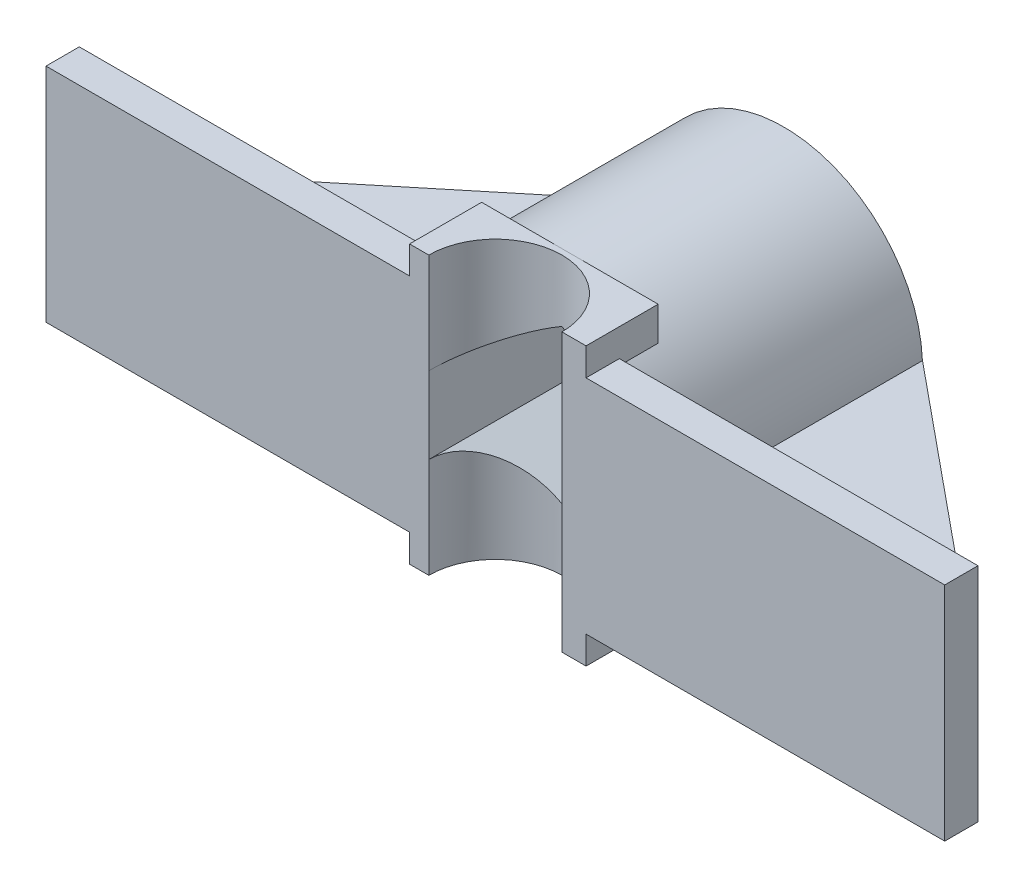
ISO-10303-21;
HEADER;
FILE_DESCRIPTION(('STEP AP214'),'2;1');
FILE_NAME('part.step','',(''),(''),'','','');
FILE_SCHEMA(('AUTOMOTIVE_DESIGN { 1 0 10303 214 1 1 1 1 }'));
ENDSEC;
DATA;
#1=APPLICATION_CONTEXT('core data for automotive mechanical design processes');
#2=APPLICATION_PROTOCOL_DEFINITION('international standard','automotive_design',2000,#1);
#3=PRODUCT_CONTEXT('',#1,'mechanical');
#4=PRODUCT('Part','Part','',(#3));
#5=PRODUCT_RELATED_PRODUCT_CATEGORY('part','',(#4));
#6=PRODUCT_DEFINITION_FORMATION('','',#4);
#7=PRODUCT_DEFINITION_CONTEXT('part definition',#1,'design');
#8=PRODUCT_DEFINITION('design','',#6,#7);
#9=PRODUCT_DEFINITION_SHAPE('','',#8);
#10=(LENGTH_UNIT() NAMED_UNIT(*) SI_UNIT(.MILLI.,.METRE.));
#11=(NAMED_UNIT(*) PLANE_ANGLE_UNIT() SI_UNIT($,.RADIAN.));
#12=(NAMED_UNIT(*) SI_UNIT($,.STERADIAN.) SOLID_ANGLE_UNIT());
#13=UNCERTAINTY_MEASURE_WITH_UNIT(LENGTH_MEASURE(1.E-05),#10,'distance_accuracy_value','');
#14=(GEOMETRIC_REPRESENTATION_CONTEXT(3) GLOBAL_UNCERTAINTY_ASSIGNED_CONTEXT((#13)) GLOBAL_UNIT_ASSIGNED_CONTEXT((#10,
#11,#12)) REPRESENTATION_CONTEXT('',''));
#15=CARTESIAN_POINT('',(0.,0.,0.));
#16=DIRECTION('',(0.,0.,1.));
#17=DIRECTION('',(1.,0.,0.));
#18=AXIS2_PLACEMENT_3D('',#15,#16,#17);
#19=CARTESIAN_POINT('',(0.,0.,-6.));
#20=DIRECTION('',(0.,0.,-1.));
#21=DIRECTION('',(-1.,0.,0.));
#22=AXIS2_PLACEMENT_3D('',#19,#20,#21);
#23=PLANE('',#22);
#24=DIRECTION('',(0.,-1.,0.));
#25=VECTOR('',#24,1.);
#26=CARTESIAN_POINT('',(-81.,-20.,-6.));
#27=LINE('',#26,#25);
#28=CARTESIAN_POINT('',(-81.,-1.,-5.99999999999996));
#29=VERTEX_POINT('',#28);
#30=CARTESIAN_POINT('',(-81.,-20.,-6.));
#31=VERTEX_POINT('',#30);
#32=EDGE_CURVE('E474',#29,#31,#27,.T.);
#33=ORIENTED_EDGE('',*,*,#32,.F.);
#34=DIRECTION('',(1.,0.,0.));
#35=VECTOR('',#34,1.);
#36=CARTESIAN_POINT('',(0.,-1.,-6.));
#37=LINE('',#36,#35);
#38=CARTESIAN_POINT('',(-24.9799919935936,-1.,-6.));
#39=VERTEX_POINT('',#38);
#40=EDGE_CURVE('E263',#29,#39,#37,.T.);
#41=ORIENTED_EDGE('',*,*,#40,.T.);
#42=CARTESIAN_POINT('',(0.,0.,-6.));
#43=DIRECTION('',(0.,0.,-1.));
#44=DIRECTION('',(-1.,0.,0.));
#45=AXIS2_PLACEMENT_3D('',#42,#43,#44);
#46=CIRCLE('',#45,25.);
#47=CARTESIAN_POINT('',(-15.4708746013094,-19.6380253353172,-6.));
#48=VERTEX_POINT('',#47);
#49=EDGE_CURVE('E364',#48,#39,#46,.T.);
#50=ORIENTED_EDGE('',*,*,#49,.F.);
#51=DIRECTION('',(0.,1.,0.));
#52=VECTOR('',#51,1.);
#53=CARTESIAN_POINT('',(-15.4708746013094,0.,-6.));
#54=LINE('',#53,#52);
#55=CARTESIAN_POINT('',(-15.4708746013094,-20.,-6.));
#56=VERTEX_POINT('',#55);
#57=EDGE_CURVE('E459',#56,#48,#54,.T.);
#58=ORIENTED_EDGE('',*,*,#57,.F.);
#59=DIRECTION('',(1.,0.,0.));
#60=VECTOR('',#59,1.);
#61=CARTESIAN_POINT('',(-81.,-20.,-6.));
#62=LINE('',#61,#60);
#63=EDGE_CURVE('E479',#31,#56,#62,.T.);
#64=ORIENTED_EDGE('',*,*,#63,.F.);
#65=EDGE_LOOP('',(#33,#41,#50,#58,#64));
#66=FACE_BOUND('',#65,.T.);
#67=ADVANCED_FACE('F39',(#66),#23,.T.);
#68=CARTESIAN_POINT('',(0.,0.,-6.));
#69=DIRECTION('',(0.,0.,-1.));
#70=DIRECTION('',(-1.,0.,0.));
#71=AXIS2_PLACEMENT_3D('',#68,#69,#70);
#72=CYLINDRICAL_SURFACE('',#71,25.);
#73=ORIENTED_EDGE('',*,*,#49,.T.);
#74=DIRECTION('',(0.,0.,-1.));
#75=VECTOR('',#74,1.);
#76=CARTESIAN_POINT('',(-24.9799919935936,-1.,-6.));
#77=LINE('',#76,#75);
#78=CARTESIAN_POINT('',(-24.9799919935936,-1.,-52.));
#79=VERTEX_POINT('',#78);
#80=EDGE_CURVE('E284',#39,#79,#77,.T.);
#81=ORIENTED_EDGE('',*,*,#80,.T.);
#82=CARTESIAN_POINT('',(0.,0.,-52.));
#83=DIRECTION('',(0.,0.,-1.));
#84=DIRECTION('',(-1.,0.,0.));
#85=AXIS2_PLACEMENT_3D('',#82,#83,#84);
#86=CIRCLE('',#85,25.);
#87=CARTESIAN_POINT('',(24.9799919935936,-1.,-52.));
#88=VERTEX_POINT('',#87);
#89=EDGE_CURVE('E64',#88,#79,#86,.T.);
#90=ORIENTED_EDGE('',*,*,#89,.F.);
#91=DIRECTION('',(0.,0.,-1.));
#92=VECTOR('',#91,1.);
#93=CARTESIAN_POINT('',(24.9799919935936,-1.,-6.));
#94=LINE('',#93,#92);
#95=CARTESIAN_POINT('',(24.9799919935936,-1.,-6.));
#96=VERTEX_POINT('',#95);
#97=EDGE_CURVE('E306',#88,#96,#94,.F.);
#98=ORIENTED_EDGE('',*,*,#97,.T.);
#99=CARTESIAN_POINT('',(16.3499015672928,-18.9124487769256,-6.));
#100=VERTEX_POINT('',#99);
#101=EDGE_CURVE('E367',#96,#100,#46,.T.);
#102=ORIENTED_EDGE('',*,*,#101,.T.);
#103=DIRECTION('',(0.,0.,-1.));
#104=VECTOR('',#103,1.);
#105=CARTESIAN_POINT('',(16.3499015672928,-18.9124487769256,-6.));
#106=LINE('',#105,#104);
#107=CARTESIAN_POINT('',(16.3499015672928,-18.9124487769256,-13.));
#108=VERTEX_POINT('',#107);
#109=EDGE_CURVE('E380',#100,#108,#106,.T.);
#110=ORIENTED_EDGE('',*,*,#109,.T.);
#111=CARTESIAN_POINT('',(0.,0.,-13.));
#112=DIRECTION('',(0.,0.,-1.));
#113=DIRECTION('',(-1.,0.,0.));
#114=AXIS2_PLACEMENT_3D('',#111,#112,#113);
#115=CIRCLE('',#114,25.);
#116=CARTESIAN_POINT('',(0.,-25.,-13.));
#117=VERTEX_POINT('',#116);
#118=EDGE_CURVE('E383',#108,#117,#115,.T.);
#119=ORIENTED_EDGE('',*,*,#118,.T.);
#120=CARTESIAN_POINT('',(-15.4708746013094,-19.6380253353172,-13.));
#121=VERTEX_POINT('',#120);
#122=EDGE_CURVE('E369',#117,#121,#115,.T.);
#123=ORIENTED_EDGE('',*,*,#122,.T.);
#124=DIRECTION('',(0.,0.,-1.));
#125=VECTOR('',#124,1.);
#126=CARTESIAN_POINT('',(-15.4708746013094,-19.6380253353172,-6.));
#127=LINE('',#126,#125);
#128=EDGE_CURVE('E372',#121,#48,#127,.F.);
#129=ORIENTED_EDGE('',*,*,#128,.T.);
#130=EDGE_LOOP('',(#73,#81,#90,#98,#102,#110,#119,#123,#129));
#131=FACE_BOUND('',#130,.T.);
#132=ADVANCED_FACE('F594',(#131),#72,.T.);
#133=ORIENTED_EDGE('',*,*,#101,.F.);
#134=DIRECTION('',(1.,0.,0.));
#135=VECTOR('',#134,1.);
#136=CARTESIAN_POINT('',(0.,-1.,-6.));
#137=LINE('',#136,#135);
#138=CARTESIAN_POINT('',(81.,-1.,-6.00000000000001));
#139=VERTEX_POINT('',#138);
#140=EDGE_CURVE('E303',#96,#139,#137,.T.);
#141=ORIENTED_EDGE('',*,*,#140,.T.);
#142=DIRECTION('',(0.,1.,0.));
#143=VECTOR('',#142,1.);
#144=CARTESIAN_POINT('',(81.,-20.,-6.));
#145=LINE('',#144,#143);
#146=CARTESIAN_POINT('',(81.,-20.,-6.));
#147=VERTEX_POINT('',#146);
#148=EDGE_CURVE('E466',#147,#139,#145,.T.);
#149=ORIENTED_EDGE('',*,*,#148,.F.);
#150=CARTESIAN_POINT('',(16.3499015672928,-20.,-6.));
#151=VERTEX_POINT('',#150);
#152=EDGE_CURVE('E478',#151,#147,#62,.T.);
#153=ORIENTED_EDGE('',*,*,#152,.F.);
#154=DIRECTION('',(0.,-1.,0.));
#155=VECTOR('',#154,1.);
#156=CARTESIAN_POINT('',(16.3499015672928,0.,-6.));
#157=LINE('',#156,#155);
#158=EDGE_CURVE('E443',#100,#151,#157,.T.);
#159=ORIENTED_EDGE('',*,*,#158,.F.);
#160=EDGE_LOOP('',(#133,#141,#149,#153,#159));
#161=FACE_BOUND('',#160,.T.);
#162=ADVANCED_FACE('F588',(#161),#23,.T.);
#163=CARTESIAN_POINT('',(0.,-25.,0.));
#164=DIRECTION('',(0.,1.,0.));
#165=DIRECTION('',(0.,0.,1.));
#166=AXIS2_PLACEMENT_3D('',#163,#164,#165);
#167=CYLINDRICAL_SURFACE('',#166,12.);
#168=CARTESIAN_POINT('',(0.,-13.856406460551,0.));
#169=DIRECTION('',(0.5,-0.866025403784439,0.));
#170=DIRECTION('',(0.866025403784439,0.5,0.));
#171=AXIS2_PLACEMENT_3D('',#168,#169,#170);
#172=ELLIPSE('',#171,13.856406460551,12.);
#173=CARTESIAN_POINT('',(12.,-6.92820323027551,0.));
#174=VERTEX_POINT('',#173);
#175=CARTESIAN_POINT('',(0.,-13.856406460551,-12.));
#176=VERTEX_POINT('',#175);
#177=EDGE_CURVE('E352',#174,#176,#172,.F.);
#178=ORIENTED_EDGE('',*,*,#177,.T.);
#179=CARTESIAN_POINT('',(0.,-13.856406460551,0.));
#180=DIRECTION('',(-0.5,-0.866025403784439,0.));
#181=DIRECTION('',(-0.866025403784439,0.5,0.));
#182=AXIS2_PLACEMENT_3D('',#179,#180,#181);
#183=ELLIPSE('',#182,13.856406460551,12.);
#184=CARTESIAN_POINT('',(-12.,-6.92820323027551,0.));
#185=VERTEX_POINT('',#184);
#186=EDGE_CURVE('E355',#176,#185,#183,.F.);
#187=ORIENTED_EDGE('',*,*,#186,.T.);
#188=DIRECTION('',(0.,1.,0.));
#189=VECTOR('',#188,1.);
#190=CARTESIAN_POINT('',(-12.,-25.,0.));
#191=LINE('',#190,#189);
#192=CARTESIAN_POINT('',(-12.,-25.,0.));
#193=VERTEX_POINT('',#192);
#194=EDGE_CURVE('E398',#193,#185,#191,.T.);
#195=ORIENTED_EDGE('',*,*,#194,.F.);
#196=CARTESIAN_POINT('',(0.,-25.,0.));
#197=DIRECTION('',(0.,1.,0.));
#198=DIRECTION('',(0.,0.,1.));
#199=AXIS2_PLACEMENT_3D('',#196,#197,#198);
#200=CIRCLE('',#199,12.);
#201=CARTESIAN_POINT('',(12.,-25.,0.));
#202=VERTEX_POINT('',#201);
#203=EDGE_CURVE('E388',#202,#193,#200,.T.);
#204=ORIENTED_EDGE('',*,*,#203,.F.);
#205=DIRECTION('',(0.,1.,0.));
#206=VECTOR('',#205,1.);
#207=CARTESIAN_POINT('',(12.,-25.,0.));
#208=LINE('',#207,#206);
#209=EDGE_CURVE('E393',#202,#174,#208,.T.);
#210=ORIENTED_EDGE('',*,*,#209,.T.);
#211=EDGE_LOOP('',(#178,#187,#195,#204,#210));
#212=FACE_BOUND('',#211,.T.);
#213=ADVANCED_FACE('F568',(#212),#167,.F.);
#214=CARTESIAN_POINT('',(-15.4708746013094,0.,0.));
#215=DIRECTION('',(-1.,0.,0.));
#216=DIRECTION('',(0.,0.,1.));
#217=AXIS2_PLACEMENT_3D('',#214,#215,#216);
#218=PLANE('',#217);
#219=DIRECTION('',(0.,0.,-1.));
#220=VECTOR('',#219,1.);
#221=CARTESIAN_POINT('',(-15.4708746013094,19.6380253353172,-6.));
#222=LINE('',#221,#220);
#223=CARTESIAN_POINT('',(-15.4708746013094,19.6380253353172,-6.));
#224=VERTEX_POINT('',#223);
#225=CARTESIAN_POINT('',(-15.4708746013094,19.6380253353172,-13.));
#226=VERTEX_POINT('',#225);
#227=EDGE_CURVE('E384',#224,#226,#222,.T.);
#228=ORIENTED_EDGE('',*,*,#227,.F.);
#229=CARTESIAN_POINT('',(-15.4708746013094,20.,-6.));
#230=VERTEX_POINT('',#229);
#231=EDGE_CURVE('E458',#224,#230,#54,.T.);
#232=ORIENTED_EDGE('',*,*,#231,.T.);
#233=DIRECTION('',(0.,0.,1.));
#234=VECTOR('',#233,1.);
#235=CARTESIAN_POINT('',(-15.4708746013094,20.,-6.));
#236=LINE('',#235,#234);
#237=CARTESIAN_POINT('',(-15.4708746013094,20.,0.));
#238=VERTEX_POINT('',#237);
#239=EDGE_CURVE('E462',#230,#238,#236,.T.);
#240=ORIENTED_EDGE('',*,*,#239,.T.);
#241=DIRECTION('',(0.,1.,0.));
#242=VECTOR('',#241,1.);
#243=CARTESIAN_POINT('',(-15.4708746013094,0.,0.));
#244=LINE('',#243,#242);
#245=CARTESIAN_POINT('',(-15.4708746013094,25.,0.));
#246=VERTEX_POINT('',#245);
#247=EDGE_CURVE('E439',#238,#246,#244,.T.);
#248=ORIENTED_EDGE('',*,*,#247,.T.);
#249=DIRECTION('',(0.,0.,1.));
#250=VECTOR('',#249,1.);
#251=CARTESIAN_POINT('',(-15.4708746013094,25.,0.));
#252=LINE('',#251,#250);
#253=CARTESIAN_POINT('',(-15.4708746013094,25.,-13.));
#254=VERTEX_POINT('',#253);
#255=EDGE_CURVE('E425',#254,#246,#252,.T.);
#256=ORIENTED_EDGE('',*,*,#255,.F.);
#257=DIRECTION('',(0.,1.,0.));
#258=VECTOR('',#257,1.);
#259=CARTESIAN_POINT('',(-15.4708746013094,0.,-13.));
#260=LINE('',#259,#258);
#261=EDGE_CURVE('E444',#226,#254,#260,.T.);
#262=ORIENTED_EDGE('',*,*,#261,.F.);
#263=EDGE_LOOP('',(#228,#232,#240,#248,#256,#262));
#264=FACE_BOUND('',#263,.T.);
#265=ADVANCED_FACE('F534',(#264),#218,.T.);
#266=CARTESIAN_POINT('',(-15.4708746013094,0.,-13.));
#267=DIRECTION('',(0.,0.,-1.));
#268=DIRECTION('',(-1.,0.,0.));
#269=AXIS2_PLACEMENT_3D('',#266,#267,#268);
#270=PLANE('',#269);
#271=CARTESIAN_POINT('',(0.,25.,-13.));
#272=VERTEX_POINT('',#271);
#273=EDGE_CURVE('E373',#226,#272,#115,.T.);
#274=ORIENTED_EDGE('',*,*,#273,.F.);
#275=ORIENTED_EDGE('',*,*,#261,.T.);
#276=DIRECTION('',(-1.,0.,0.));
#277=VECTOR('',#276,1.);
#278=CARTESIAN_POINT('',(-15.4708746013094,25.,-13.));
#279=LINE('',#278,#277);
#280=EDGE_CURVE('E435',#272,#254,#279,.T.);
#281=ORIENTED_EDGE('',*,*,#280,.F.);
#282=EDGE_LOOP('',(#274,#275,#281));
#283=FACE_BOUND('',#282,.T.);
#284=ADVANCED_FACE('F529',(#283),#270,.T.);
#285=CARTESIAN_POINT('',(16.3499015672928,18.9124487769256,-13.));
#286=VERTEX_POINT('',#285);
#287=EDGE_CURVE('E374',#272,#286,#115,.T.);
#288=ORIENTED_EDGE('',*,*,#287,.F.);
#289=CARTESIAN_POINT('',(16.3499015672928,25.,-13.));
#290=VERTEX_POINT('',#289);
#291=EDGE_CURVE('E436',#290,#272,#279,.T.);
#292=ORIENTED_EDGE('',*,*,#291,.F.);
#293=DIRECTION('',(0.,1.,0.));
#294=VECTOR('',#293,1.);
#295=CARTESIAN_POINT('',(16.3499015672928,0.,-13.));
#296=LINE('',#295,#294);
#297=EDGE_CURVE('E448',#286,#290,#296,.T.);
#298=ORIENTED_EDGE('',*,*,#297,.F.);
#299=EDGE_LOOP('',(#288,#292,#298));
#300=FACE_BOUND('',#299,.T.);
#301=ADVANCED_FACE('F524',(#300),#270,.T.);
#302=ORIENTED_EDGE('',*,*,#118,.F.);
#303=CARTESIAN_POINT('',(16.3499015672928,-25.,-13.));
#304=VERTEX_POINT('',#303);
#305=EDGE_CURVE('E445',#304,#108,#296,.T.);
#306=ORIENTED_EDGE('',*,*,#305,.F.);
#307=DIRECTION('',(-1.,0.,0.));
#308=VECTOR('',#307,1.);
#309=CARTESIAN_POINT('',(-15.4708746013094,-25.,-13.));
#310=LINE('',#309,#308);
#311=EDGE_CURVE('E404',#304,#117,#310,.T.);
#312=ORIENTED_EDGE('',*,*,#311,.T.);
#313=EDGE_LOOP('',(#302,#306,#312));
#314=FACE_BOUND('',#313,.T.);
#315=ADVANCED_FACE('F795',(#314),#270,.T.);
#316=CARTESIAN_POINT('',(16.3499015672928,0.,0.));
#317=DIRECTION('',(1.,0.,0.));
#318=DIRECTION('',(0.,0.,-1.));
#319=AXIS2_PLACEMENT_3D('',#316,#317,#318);
#320=PLANE('',#319);
#321=ORIENTED_EDGE('',*,*,#109,.F.);
#322=ORIENTED_EDGE('',*,*,#158,.T.);
#323=DIRECTION('',(0.,0.,-1.));
#324=VECTOR('',#323,1.);
#325=CARTESIAN_POINT('',(16.3499015672928,-20.,-6.));
#326=LINE('',#325,#324);
#327=CARTESIAN_POINT('',(16.3499015672928,-20.,0.));
#328=VERTEX_POINT('',#327);
#329=EDGE_CURVE('E417',#328,#151,#326,.T.);
#330=ORIENTED_EDGE('',*,*,#329,.F.);
#331=DIRECTION('',(0.,-1.,0.));
#332=VECTOR('',#331,1.);
#333=CARTESIAN_POINT('',(16.3499015672928,0.,0.));
#334=LINE('',#333,#332);
#335=CARTESIAN_POINT('',(16.3499015672928,-25.,0.));
#336=VERTEX_POINT('',#335);
#337=EDGE_CURVE('E414',#328,#336,#334,.T.);
#338=ORIENTED_EDGE('',*,*,#337,.T.);
#339=DIRECTION('',(0.,0.,-1.));
#340=VECTOR('',#339,1.);
#341=CARTESIAN_POINT('',(16.3499015672928,-25.,0.));
#342=LINE('',#341,#340);
#343=EDGE_CURVE('E407',#336,#304,#342,.T.);
#344=ORIENTED_EDGE('',*,*,#343,.T.);
#345=ORIENTED_EDGE('',*,*,#305,.T.);
#346=EDGE_LOOP('',(#321,#322,#330,#338,#344,#345));
#347=FACE_BOUND('',#346,.T.);
#348=ADVANCED_FACE('F580',(#347),#320,.T.);
#349=CARTESIAN_POINT('',(0.,0.,0.));
#350=DIRECTION('',(0.,0.,-1.));
#351=DIRECTION('',(-1.,0.,0.));
#352=AXIS2_PLACEMENT_3D('',#349,#350,#351);
#353=PLANE('',#352);
#354=DIRECTION('',(0.,-1.,0.));
#355=VECTOR('',#354,1.);
#356=CARTESIAN_POINT('',(-81.,-20.,0.));
#357=LINE('',#356,#355);
#358=CARTESIAN_POINT('',(-81.,20.,0.));
#359=VERTEX_POINT('',#358);
#360=CARTESIAN_POINT('',(-81.,-20.,0.));
#361=VERTEX_POINT('',#360);
#362=EDGE_CURVE('E487',#359,#361,#357,.T.);
#363=ORIENTED_EDGE('',*,*,#362,.T.);
#364=DIRECTION('',(1.,0.,0.));
#365=VECTOR('',#364,1.);
#366=CARTESIAN_POINT('',(-81.,-20.,0.));
#367=LINE('',#366,#365);
#368=CARTESIAN_POINT('',(-15.4708746013094,-20.,0.));
#369=VERTEX_POINT('',#368);
#370=EDGE_CURVE('E490',#361,#369,#367,.T.);
#371=ORIENTED_EDGE('',*,*,#370,.T.);
#372=DIRECTION('',(0.,-1.,0.));
#373=VECTOR('',#372,1.);
#374=CARTESIAN_POINT('',(-15.4708746013094,0.,0.));
#375=LINE('',#374,#373);
#376=CARTESIAN_POINT('',(-15.4708746013094,-25.,0.));
#377=VERTEX_POINT('',#376);
#378=EDGE_CURVE('E415',#369,#377,#375,.T.);
#379=ORIENTED_EDGE('',*,*,#378,.T.);
#380=DIRECTION('',(1.,0.,0.));
#381=VECTOR('',#380,1.);
#382=CARTESIAN_POINT('',(-15.4708746013094,-25.,0.));
#383=LINE('',#382,#381);
#384=EDGE_CURVE('E411',#377,#193,#383,.T.);
#385=ORIENTED_EDGE('',*,*,#384,.T.);
#386=ORIENTED_EDGE('',*,*,#194,.T.);
#387=DIRECTION('',(0.,1.,0.));
#388=VECTOR('',#387,1.);
#389=CARTESIAN_POINT('',(-12.,-6.92820323027551,0.));
#390=LINE('',#389,#388);
#391=CARTESIAN_POINT('',(-12.,6.92820323027552,0.));
#392=VERTEX_POINT('',#391);
#393=EDGE_CURVE('E318',#185,#392,#390,.T.);
#394=ORIENTED_EDGE('',*,*,#393,.T.);
#395=CARTESIAN_POINT('',(-12.,25.,0.));
#396=VERTEX_POINT('',#395);
#397=EDGE_CURVE('E390',#392,#396,#191,.T.);
#398=ORIENTED_EDGE('',*,*,#397,.T.);
#399=DIRECTION('',(1.,0.,0.));
#400=VECTOR('',#399,1.);
#401=CARTESIAN_POINT('',(-15.4708746013094,25.,0.));
#402=LINE('',#401,#400);
#403=EDGE_CURVE('E429',#246,#396,#402,.T.);
#404=ORIENTED_EDGE('',*,*,#403,.F.);
#405=ORIENTED_EDGE('',*,*,#247,.F.);
#406=DIRECTION('',(-1.,0.,0.));
#407=VECTOR('',#406,1.);
#408=CARTESIAN_POINT('',(-81.,20.,0.));
#409=LINE('',#408,#407);
#410=EDGE_CURVE('E483',#238,#359,#409,.T.);
#411=ORIENTED_EDGE('',*,*,#410,.T.);
#412=EDGE_LOOP('',(#363,#371,#379,#385,#386,#394,#398,#404,#405,#411));
#413=FACE_BOUND('',#412,.T.);
#414=ADVANCED_FACE('F539',(#413),#353,.F.);
#415=CARTESIAN_POINT('',(-81.,-20.,-6.));
#416=DIRECTION('',(0.,-1.,0.));
#417=DIRECTION('',(0.,0.,-1.));
#418=AXIS2_PLACEMENT_3D('',#415,#416,#417);
#419=PLANE('',#418);
#420=ORIENTED_EDGE('',*,*,#63,.T.);
#421=DIRECTION('',(0.,0.,1.));
#422=VECTOR('',#421,1.);
#423=CARTESIAN_POINT('',(-15.4708746013094,-20.,-6.));
#424=LINE('',#423,#422);
#425=EDGE_CURVE('E422',#56,#369,#424,.T.);
#426=ORIENTED_EDGE('',*,*,#425,.T.);
#427=ORIENTED_EDGE('',*,*,#370,.F.);
#428=DIRECTION('',(0.,0.,1.));
#429=VECTOR('',#428,1.);
#430=CARTESIAN_POINT('',(-81.,-20.,-6.));
#431=LINE('',#430,#429);
#432=EDGE_CURVE('E48',#31,#361,#431,.T.);
#433=ORIENTED_EDGE('',*,*,#432,.F.);
#434=EDGE_LOOP('',(#420,#426,#427,#433));
#435=FACE_BOUND('',#434,.T.);
#436=ADVANCED_FACE('F610',(#435),#419,.T.);
#437=CARTESIAN_POINT('',(81.,-20.,0.));
#438=VERTEX_POINT('',#437);
#439=EDGE_CURVE('E489',#328,#438,#367,.T.);
#440=ORIENTED_EDGE('',*,*,#439,.F.);
#441=ORIENTED_EDGE('',*,*,#329,.T.);
#442=ORIENTED_EDGE('',*,*,#152,.T.);
#443=DIRECTION('',(0.,0.,1.));
#444=VECTOR('',#443,1.);
#445=CARTESIAN_POINT('',(81.,-20.,-6.));
#446=LINE('',#445,#444);
#447=EDGE_CURVE('E11',#147,#438,#446,.T.);
#448=ORIENTED_EDGE('',*,*,#447,.T.);
#449=EDGE_LOOP('',(#440,#441,#442,#448));
#450=FACE_BOUND('',#449,.T.);
#451=ADVANCED_FACE('F583',(#450),#419,.T.);
#452=DIRECTION('',(1.,0.,0.));
#453=VECTOR('',#452,1.);
#454=CARTESIAN_POINT('',(0.,1.,-6.));
#455=LINE('',#454,#453);
#456=CARTESIAN_POINT('',(-81.,1.,-5.99999999999996));
#457=VERTEX_POINT('',#456);
#458=CARTESIAN_POINT('',(-24.9799919935936,1.,-6.));
#459=VERTEX_POINT('',#458);
#460=EDGE_CURVE('E286',#457,#459,#455,.T.);
#461=ORIENTED_EDGE('',*,*,#460,.F.);
#462=CARTESIAN_POINT('',(-81.,20.,-6.));
#463=VERTEX_POINT('',#462);
#464=EDGE_CURVE('E475',#463,#457,#27,.T.);
#465=ORIENTED_EDGE('',*,*,#464,.F.);
#466=DIRECTION('',(-1.,0.,0.));
#467=VECTOR('',#466,1.);
#468=CARTESIAN_POINT('',(-81.,20.,-6.));
#469=LINE('',#468,#467);
#470=EDGE_CURVE('E469',#230,#463,#469,.T.);
#471=ORIENTED_EDGE('',*,*,#470,.F.);
#472=ORIENTED_EDGE('',*,*,#231,.F.);
#473=EDGE_CURVE('E363',#459,#224,#46,.T.);
#474=ORIENTED_EDGE('',*,*,#473,.F.);
#475=EDGE_LOOP('',(#461,#465,#471,#472,#474));
#476=FACE_BOUND('',#475,.T.);
#477=ADVANCED_FACE('F602',(#476),#23,.T.);
#478=DIRECTION('',(1.,0.,0.));
#479=VECTOR('',#478,1.);
#480=CARTESIAN_POINT('',(0.,1.,-6.));
#481=LINE('',#480,#479);
#482=CARTESIAN_POINT('',(24.9799919935936,1.,-6.));
#483=VERTEX_POINT('',#482);
#484=CARTESIAN_POINT('',(81.,1.,-6.00000000000001));
#485=VERTEX_POINT('',#484);
#486=EDGE_CURVE('E308',#483,#485,#481,.T.);
#487=ORIENTED_EDGE('',*,*,#486,.F.);
#488=CARTESIAN_POINT('',(16.3499015672928,18.9124487769256,-6.));
#489=VERTEX_POINT('',#488);
#490=EDGE_CURVE('E368',#489,#483,#46,.T.);
#491=ORIENTED_EDGE('',*,*,#490,.F.);
#492=CARTESIAN_POINT('',(16.3499015672928,20.,-6.));
#493=VERTEX_POINT('',#492);
#494=EDGE_CURVE('E453',#493,#489,#157,.T.);
#495=ORIENTED_EDGE('',*,*,#494,.F.);
#496=CARTESIAN_POINT('',(81.,20.,-6.));
#497=VERTEX_POINT('',#496);
#498=EDGE_CURVE('E471',#497,#493,#469,.T.);
#499=ORIENTED_EDGE('',*,*,#498,.F.);
#500=EDGE_CURVE('E470',#485,#497,#145,.T.);
#501=ORIENTED_EDGE('',*,*,#500,.F.);
#502=EDGE_LOOP('',(#487,#491,#495,#499,#501));
#503=FACE_BOUND('',#502,.T.);
#504=ADVANCED_FACE('F646',(#503),#23,.T.);
#505=CARTESIAN_POINT('',(-81.,20.,-6.));
#506=DIRECTION('',(0.,1.,0.));
#507=DIRECTION('',(0.,0.,1.));
#508=AXIS2_PLACEMENT_3D('',#505,#506,#507);
#509=PLANE('',#508);
#510=ORIENTED_EDGE('',*,*,#239,.F.);
#511=ORIENTED_EDGE('',*,*,#470,.T.);
#512=DIRECTION('',(0.,0.,1.));
#513=VECTOR('',#512,1.);
#514=CARTESIAN_POINT('',(-81.,20.,-6.));
#515=LINE('',#514,#513);
#516=EDGE_CURVE('E494',#463,#359,#515,.T.);
#517=ORIENTED_EDGE('',*,*,#516,.T.);
#518=ORIENTED_EDGE('',*,*,#410,.F.);
#519=EDGE_LOOP('',(#510,#511,#517,#518));
#520=FACE_BOUND('',#519,.T.);
#521=ADVANCED_FACE('F604',(#520),#509,.T.);
#522=CARTESIAN_POINT('',(81.,-20.,-6.));
#523=DIRECTION('',(1.,0.,0.));
#524=DIRECTION('',(0.,0.,-1.));
#525=AXIS2_PLACEMENT_3D('',#522,#523,#524);
#526=PLANE('',#525);
#527=DIRECTION('',(0.,0.,1.));
#528=VECTOR('',#527,1.);
#529=CARTESIAN_POINT('',(81.,20.,-6.));
#530=LINE('',#529,#528);
#531=CARTESIAN_POINT('',(81.,20.,0.));
#532=VERTEX_POINT('',#531);
#533=EDGE_CURVE('E43',#497,#532,#530,.T.);
#534=ORIENTED_EDGE('',*,*,#533,.T.);
#535=DIRECTION('',(0.,1.,0.));
#536=VECTOR('',#535,1.);
#537=CARTESIAN_POINT('',(81.,-20.,0.));
#538=LINE('',#537,#536);
#539=EDGE_CURVE('E465',#438,#532,#538,.T.);
#540=ORIENTED_EDGE('',*,*,#539,.F.);
#541=ORIENTED_EDGE('',*,*,#447,.F.);
#542=ORIENTED_EDGE('',*,*,#148,.T.);
#543=DIRECTION('',(0.,-1.,0.));
#544=VECTOR('',#543,1.);
#545=CARTESIAN_POINT('',(81.,-20.,-6.));
#546=LINE('',#545,#544);
#547=EDGE_CURVE('E312',#139,#485,#546,.F.);
#548=ORIENTED_EDGE('',*,*,#547,.T.);
#549=ORIENTED_EDGE('',*,*,#500,.T.);
#550=EDGE_LOOP('',(#534,#540,#541,#542,#548,#549));
#551=FACE_BOUND('',#550,.T.);
#552=ADVANCED_FACE('F41',(#551),#526,.T.);
#553=CARTESIAN_POINT('',(-81.,-20.,-6.));
#554=DIRECTION('',(-1.,0.,0.));
#555=DIRECTION('',(0.,0.,1.));
#556=AXIS2_PLACEMENT_3D('',#553,#554,#555);
#557=PLANE('',#556);
#558=ORIENTED_EDGE('',*,*,#464,.T.);
#559=DIRECTION('',(0.,-1.,0.));
#560=VECTOR('',#559,1.);
#561=CARTESIAN_POINT('',(-81.,-20.,-5.99999999999995));
#562=LINE('',#561,#560);
#563=EDGE_CURVE('E277',#457,#29,#562,.T.);
#564=ORIENTED_EDGE('',*,*,#563,.T.);
#565=ORIENTED_EDGE('',*,*,#32,.T.);
#566=ORIENTED_EDGE('',*,*,#432,.T.);
#567=ORIENTED_EDGE('',*,*,#362,.F.);
#568=ORIENTED_EDGE('',*,*,#516,.F.);
#569=EDGE_LOOP('',(#558,#564,#565,#566,#567,#568));
#570=FACE_BOUND('',#569,.T.);
#571=ADVANCED_FACE('F606',(#570),#557,.T.);
#572=DIRECTION('',(0.,0.,-1.));
#573=VECTOR('',#572,1.);
#574=CARTESIAN_POINT('',(16.3499015672928,20.,-6.));
#575=LINE('',#574,#573);
#576=CARTESIAN_POINT('',(16.3499015672928,20.,0.));
#577=VERTEX_POINT('',#576);
#578=EDGE_CURVE('E455',#577,#493,#575,.T.);
#579=ORIENTED_EDGE('',*,*,#578,.F.);
#580=EDGE_CURVE('E484',#532,#577,#409,.T.);
#581=ORIENTED_EDGE('',*,*,#580,.F.);
#582=ORIENTED_EDGE('',*,*,#533,.F.);
#583=ORIENTED_EDGE('',*,*,#498,.T.);
#584=EDGE_LOOP('',(#579,#581,#582,#583));
#585=FACE_BOUND('',#584,.T.);
#586=ADVANCED_FACE('F508',(#585),#509,.T.);
#587=DIRECTION('',(0.,-1.,0.));
#588=VECTOR('',#587,1.);
#589=CARTESIAN_POINT('',(12.,6.92820323027551,0.));
#590=LINE('',#589,#588);
#591=CARTESIAN_POINT('',(12.,6.92820323027551,0.));
#592=VERTEX_POINT('',#591);
#593=EDGE_CURVE('E316',#592,#174,#590,.T.);
#594=ORIENTED_EDGE('',*,*,#593,.T.);
#595=ORIENTED_EDGE('',*,*,#209,.F.);
#596=EDGE_CURVE('E410',#202,#336,#383,.T.);
#597=ORIENTED_EDGE('',*,*,#596,.T.);
#598=ORIENTED_EDGE('',*,*,#337,.F.);
#599=ORIENTED_EDGE('',*,*,#439,.T.);
#600=ORIENTED_EDGE('',*,*,#539,.T.);
#601=ORIENTED_EDGE('',*,*,#580,.T.);
#602=DIRECTION('',(0.,1.,0.));
#603=VECTOR('',#602,1.);
#604=CARTESIAN_POINT('',(16.3499015672928,0.,0.));
#605=LINE('',#604,#603);
#606=CARTESIAN_POINT('',(16.3499015672928,25.,0.));
#607=VERTEX_POINT('',#606);
#608=EDGE_CURVE('E449',#577,#607,#605,.T.);
#609=ORIENTED_EDGE('',*,*,#608,.T.);
#610=CARTESIAN_POINT('',(12.,25.,0.));
#611=VERTEX_POINT('',#610);
#612=EDGE_CURVE('E428',#611,#607,#402,.T.);
#613=ORIENTED_EDGE('',*,*,#612,.F.);
#614=EDGE_CURVE('E397',#592,#611,#208,.T.);
#615=ORIENTED_EDGE('',*,*,#614,.F.);
#616=EDGE_LOOP('',(#594,#595,#597,#598,#599,#600,#601,#609,#613,#615));
#617=FACE_BOUND('',#616,.T.);
#618=ADVANCED_FACE('F511',(#617),#353,.F.);
#619=ORIENTED_EDGE('',*,*,#128,.F.);
#620=CARTESIAN_POINT('',(-15.4708746013094,-25.,-13.));
#621=VERTEX_POINT('',#620);
#622=EDGE_CURVE('E440',#621,#121,#260,.T.);
#623=ORIENTED_EDGE('',*,*,#622,.F.);
#624=DIRECTION('',(0.,0.,1.));
#625=VECTOR('',#624,1.);
#626=CARTESIAN_POINT('',(-15.4708746013094,-25.,0.));
#627=LINE('',#626,#625);
#628=EDGE_CURVE('E396',#621,#377,#627,.T.);
#629=ORIENTED_EDGE('',*,*,#628,.T.);
#630=ORIENTED_EDGE('',*,*,#378,.F.);
#631=ORIENTED_EDGE('',*,*,#425,.F.);
#632=ORIENTED_EDGE('',*,*,#57,.T.);
#633=EDGE_LOOP('',(#619,#623,#629,#630,#631,#632));
#634=FACE_BOUND('',#633,.T.);
#635=ADVANCED_FACE('F614',(#634),#218,.T.);
#636=ORIENTED_EDGE('',*,*,#122,.F.);
#637=EDGE_CURVE('E403',#117,#621,#310,.T.);
#638=ORIENTED_EDGE('',*,*,#637,.T.);
#639=ORIENTED_EDGE('',*,*,#622,.T.);
#640=EDGE_LOOP('',(#636,#638,#639));
#641=FACE_BOUND('',#640,.T.);
#642=ADVANCED_FACE('F808',(#641),#270,.T.);
#643=DIRECTION('',(0.,0.,-1.));
#644=VECTOR('',#643,1.);
#645=CARTESIAN_POINT('',(16.3499015672928,18.9124487769256,-6.));
#646=LINE('',#645,#644);
#647=EDGE_CURVE('E377',#286,#489,#646,.F.);
#648=ORIENTED_EDGE('',*,*,#647,.F.);
#649=ORIENTED_EDGE('',*,*,#297,.T.);
#650=DIRECTION('',(0.,0.,-1.));
#651=VECTOR('',#650,1.);
#652=CARTESIAN_POINT('',(16.3499015672928,25.,0.));
#653=LINE('',#652,#651);
#654=EDGE_CURVE('E432',#607,#290,#653,.T.);
#655=ORIENTED_EDGE('',*,*,#654,.F.);
#656=ORIENTED_EDGE('',*,*,#608,.F.);
#657=ORIENTED_EDGE('',*,*,#578,.T.);
#658=ORIENTED_EDGE('',*,*,#494,.T.);
#659=EDGE_LOOP('',(#648,#649,#655,#656,#657,#658));
#660=FACE_BOUND('',#659,.T.);
#661=ADVANCED_FACE('F515',(#660),#320,.T.);
#662=CARTESIAN_POINT('',(0.,25.,0.));
#663=DIRECTION('',(0.,-1.,0.));
#664=DIRECTION('',(0.,0.,-1.));
#665=AXIS2_PLACEMENT_3D('',#662,#663,#664);
#666=PLANE('',#665);
#667=ORIENTED_EDGE('',*,*,#403,.T.);
#668=CARTESIAN_POINT('',(0.,25.,0.));
#669=DIRECTION('',(0.,1.,0.));
#670=DIRECTION('',(0.,0.,1.));
#671=AXIS2_PLACEMENT_3D('',#668,#669,#670);
#672=CIRCLE('',#671,12.);
#673=EDGE_CURVE('E387',#611,#396,#672,.T.);
#674=ORIENTED_EDGE('',*,*,#673,.F.);
#675=ORIENTED_EDGE('',*,*,#612,.T.);
#676=ORIENTED_EDGE('',*,*,#654,.T.);
#677=ORIENTED_EDGE('',*,*,#291,.T.);
#678=ORIENTED_EDGE('',*,*,#280,.T.);
#679=ORIENTED_EDGE('',*,*,#255,.T.);
#680=EDGE_LOOP('',(#667,#674,#675,#676,#677,#678,#679));
#681=FACE_BOUND('',#680,.T.);
#682=ADVANCED_FACE('F519',(#681),#666,.F.);
#683=CARTESIAN_POINT('',(0.,-25.,0.));
#684=DIRECTION('',(0.,1.,0.));
#685=DIRECTION('',(0.,0.,-1.));
#686=AXIS2_PLACEMENT_3D('',#683,#684,#685);
#687=PLANE('',#686);
#688=ORIENTED_EDGE('',*,*,#203,.T.);
#689=ORIENTED_EDGE('',*,*,#384,.F.);
#690=ORIENTED_EDGE('',*,*,#628,.F.);
#691=ORIENTED_EDGE('',*,*,#637,.F.);
#692=ORIENTED_EDGE('',*,*,#311,.F.);
#693=ORIENTED_EDGE('',*,*,#343,.F.);
#694=ORIENTED_EDGE('',*,*,#596,.F.);
#695=EDGE_LOOP('',(#688,#689,#690,#691,#692,#693,#694));
#696=FACE_BOUND('',#695,.T.);
#697=ADVANCED_FACE('F574',(#696),#687,.F.);
#698=ORIENTED_EDGE('',*,*,#397,.F.);
#699=CARTESIAN_POINT('',(0.,13.856406460551,0.));
#700=DIRECTION('',(-0.5,0.866025403784439,0.));
#701=DIRECTION('',(0.866025403784439,0.5,0.));
#702=AXIS2_PLACEMENT_3D('',#699,#700,#701);
#703=ELLIPSE('',#702,13.856406460551,12.);
#704=CARTESIAN_POINT('',(0.,13.856406460551,-12.));
#705=VERTEX_POINT('',#704);
#706=EDGE_CURVE('E358',#392,#705,#703,.F.);
#707=ORIENTED_EDGE('',*,*,#706,.T.);
#708=CARTESIAN_POINT('',(0.,13.856406460551,0.));
#709=DIRECTION('',(0.5,0.866025403784438,0.));
#710=DIRECTION('',(-0.866025403784439,0.5,0.));
#711=AXIS2_PLACEMENT_3D('',#708,#709,#710);
#712=ELLIPSE('',#711,13.856406460551,12.);
#713=EDGE_CURVE('E338',#705,#592,#712,.F.);
#714=ORIENTED_EDGE('',*,*,#713,.T.);
#715=ORIENTED_EDGE('',*,*,#614,.T.);
#716=ORIENTED_EDGE('',*,*,#673,.T.);
#717=EDGE_LOOP('',(#698,#707,#714,#715,#716));
#718=FACE_BOUND('',#717,.T.);
#719=ADVANCED_FACE('F546',(#718),#167,.F.);
#720=DIRECTION('',(0.,0.,-1.));
#721=VECTOR('',#720,1.);
#722=CARTESIAN_POINT('',(-24.9799919935936,1.,-6.));
#723=LINE('',#722,#721);
#724=CARTESIAN_POINT('',(-24.9799919935936,1.,-52.));
#725=VERTEX_POINT('',#724);
#726=EDGE_CURVE('E271',#459,#725,#723,.T.);
#727=ORIENTED_EDGE('',*,*,#726,.F.);
#728=ORIENTED_EDGE('',*,*,#473,.T.);
#729=ORIENTED_EDGE('',*,*,#227,.T.);
#730=ORIENTED_EDGE('',*,*,#273,.T.);
#731=ORIENTED_EDGE('',*,*,#287,.T.);
#732=ORIENTED_EDGE('',*,*,#647,.T.);
#733=ORIENTED_EDGE('',*,*,#490,.T.);
#734=DIRECTION('',(0.,0.,-1.));
#735=VECTOR('',#734,1.);
#736=CARTESIAN_POINT('',(24.9799919935936,1.,-6.));
#737=LINE('',#736,#735);
#738=CARTESIAN_POINT('',(24.9799919935936,1.,-52.));
#739=VERTEX_POINT('',#738);
#740=EDGE_CURVE('E310',#739,#483,#737,.F.);
#741=ORIENTED_EDGE('',*,*,#740,.F.);
#742=EDGE_CURVE('E361',#725,#739,#86,.T.);
#743=ORIENTED_EDGE('',*,*,#742,.F.);
#744=EDGE_LOOP('',(#727,#728,#729,#730,#731,#732,#733,#741,#743));
#745=FACE_BOUND('',#744,.T.);
#746=ADVANCED_FACE('F598',(#745),#72,.T.);
#747=CARTESIAN_POINT('',(0.,0.,-52.));
#748=DIRECTION('',(0.,0.,-1.));
#749=DIRECTION('',(-1.,0.,0.));
#750=AXIS2_PLACEMENT_3D('',#747,#748,#749);
#751=PLANE('',#750);
#752=DIRECTION('',(0.866025403784439,0.5,0.));
#753=VECTOR('',#752,1.);
#754=CARTESIAN_POINT('',(-12.,6.92820323027552,-52.));
#755=LINE('',#754,#753);
#756=CARTESIAN_POINT('',(-12.,6.92820323027552,-52.));
#757=VERTEX_POINT('',#756);
#758=CARTESIAN_POINT('',(0.,13.856406460551,-52.));
#759=VERTEX_POINT('',#758);
#760=EDGE_CURVE('E315',#757,#759,#755,.T.);
#761=ORIENTED_EDGE('',*,*,#760,.F.);
#762=DIRECTION('',(0.,1.,0.));
#763=VECTOR('',#762,1.);
#764=CARTESIAN_POINT('',(-12.,-6.92820323027551,-52.));
#765=LINE('',#764,#763);
#766=CARTESIAN_POINT('',(-12.,-6.92820323027551,-52.));
#767=VERTEX_POINT('',#766);
#768=EDGE_CURVE('E319',#767,#757,#765,.T.);
#769=ORIENTED_EDGE('',*,*,#768,.F.);
#770=DIRECTION('',(-0.866025403784439,0.5,0.));
#771=VECTOR('',#770,1.);
#772=CARTESIAN_POINT('',(0.,-13.856406460551,-52.));
#773=LINE('',#772,#771);
#774=CARTESIAN_POINT('',(0.,-13.856406460551,-52.));
#775=VERTEX_POINT('',#774);
#776=EDGE_CURVE('E331',#775,#767,#773,.T.);
#777=ORIENTED_EDGE('',*,*,#776,.F.);
#778=DIRECTION('',(-0.866025403784439,-0.5,0.));
#779=VECTOR('',#778,1.);
#780=CARTESIAN_POINT('',(12.,-6.92820323027552,-52.));
#781=LINE('',#780,#779);
#782=CARTESIAN_POINT('',(12.,-6.92820323027552,-52.));
#783=VERTEX_POINT('',#782);
#784=EDGE_CURVE('E328',#783,#775,#781,.T.);
#785=ORIENTED_EDGE('',*,*,#784,.F.);
#786=DIRECTION('',(0.,-1.,0.));
#787=VECTOR('',#786,1.);
#788=CARTESIAN_POINT('',(12.,6.92820323027551,-52.));
#789=LINE('',#788,#787);
#790=CARTESIAN_POINT('',(12.,6.92820323027551,-52.));
#791=VERTEX_POINT('',#790);
#792=EDGE_CURVE('E326',#791,#783,#789,.T.);
#793=ORIENTED_EDGE('',*,*,#792,.F.);
#794=DIRECTION('',(0.866025403784438,-0.5,0.));
#795=VECTOR('',#794,1.);
#796=CARTESIAN_POINT('',(0.,13.856406460551,-52.));
#797=LINE('',#796,#795);
#798=EDGE_CURVE('E323',#759,#791,#797,.T.);
#799=ORIENTED_EDGE('',*,*,#798,.F.);
#800=EDGE_LOOP('',(#761,#769,#777,#785,#793,#799));
#801=FACE_BOUND('',#800,.T.);
#802=ORIENTED_EDGE('',*,*,#89,.T.);
#803=DIRECTION('',(1.,0.,0.));
#804=VECTOR('',#803,1.);
#805=CARTESIAN_POINT('',(0.,-1.,-52.));
#806=LINE('',#805,#804);
#807=CARTESIAN_POINT('',(-25.,-1.,-52.));
#808=VERTEX_POINT('',#807);
#809=EDGE_CURVE('E258',#79,#808,#806,.F.);
#810=ORIENTED_EDGE('',*,*,#809,.T.);
#811=DIRECTION('',(0.,1.,0.));
#812=VECTOR('',#811,1.);
#813=CARTESIAN_POINT('',(-25.,0.,-52.));
#814=LINE('',#813,#812);
#815=CARTESIAN_POINT('',(-25.,1.,-52.));
#816=VERTEX_POINT('',#815);
#817=EDGE_CURVE('E256',#808,#816,#814,.T.);
#818=ORIENTED_EDGE('',*,*,#817,.T.);
#819=DIRECTION('',(1.,0.,0.));
#820=VECTOR('',#819,1.);
#821=CARTESIAN_POINT('',(0.,1.,-52.));
#822=LINE('',#821,#820);
#823=EDGE_CURVE('E56',#725,#816,#822,.F.);
#824=ORIENTED_EDGE('',*,*,#823,.F.);
#825=ORIENTED_EDGE('',*,*,#742,.T.);
#826=DIRECTION('',(1.,0.,0.));
#827=VECTOR('',#826,1.);
#828=CARTESIAN_POINT('',(0.,1.,-52.));
#829=LINE('',#828,#827);
#830=CARTESIAN_POINT('',(25.,1.,-52.));
#831=VERTEX_POINT('',#830);
#832=EDGE_CURVE('E295',#739,#831,#829,.T.);
#833=ORIENTED_EDGE('',*,*,#832,.T.);
#834=DIRECTION('',(0.,1.,0.));
#835=VECTOR('',#834,1.);
#836=CARTESIAN_POINT('',(25.,0.,-52.));
#837=LINE('',#836,#835);
#838=CARTESIAN_POINT('',(25.,-1.,-52.));
#839=VERTEX_POINT('',#838);
#840=EDGE_CURVE('E294',#839,#831,#837,.T.);
#841=ORIENTED_EDGE('',*,*,#840,.F.);
#842=DIRECTION('',(1.,0.,0.));
#843=VECTOR('',#842,1.);
#844=CARTESIAN_POINT('',(0.,-1.,-52.));
#845=LINE('',#844,#843);
#846=EDGE_CURVE('E290',#88,#839,#845,.T.);
#847=ORIENTED_EDGE('',*,*,#846,.F.);
#848=EDGE_LOOP('',(#802,#810,#818,#824,#825,#833,#841,#847));
#849=FACE_BOUND('',#848,.T.);
#850=ADVANCED_FACE('F257',(#801,#849),#751,.T.);
#851=CARTESIAN_POINT('',(-12.,6.92820323027552,0.));
#852=DIRECTION('',(-0.5,0.866025403784439,0.));
#853=DIRECTION('',(-0.866025403784439,-0.5,0.));
#854=AXIS2_PLACEMENT_3D('',#851,#852,#853);
#855=PLANE('',#854);
#856=DIRECTION('',(0.,0.,-1.));
#857=VECTOR('',#856,1.);
#858=CARTESIAN_POINT('',(-12.,6.92820323027552,0.));
#859=LINE('',#858,#857);
#860=EDGE_CURVE('E335',#392,#757,#859,.T.);
#861=ORIENTED_EDGE('',*,*,#860,.T.);
#862=ORIENTED_EDGE('',*,*,#760,.T.);
#863=DIRECTION('',(0.,0.,-1.));
#864=VECTOR('',#863,1.);
#865=CARTESIAN_POINT('',(0.,13.856406460551,0.));
#866=LINE('',#865,#864);
#867=EDGE_CURVE('E321',#705,#759,#866,.T.);
#868=ORIENTED_EDGE('',*,*,#867,.F.);
#869=ORIENTED_EDGE('',*,*,#706,.F.);
#870=EDGE_LOOP('',(#861,#862,#868,#869));
#871=FACE_BOUND('',#870,.T.);
#872=ADVANCED_FACE('F553',(#871),#855,.F.);
#873=CARTESIAN_POINT('',(0.,-13.856406460551,0.));
#874=DIRECTION('',(-0.5,-0.866025403784439,0.));
#875=DIRECTION('',(0.866025403784439,-0.5,0.));
#876=AXIS2_PLACEMENT_3D('',#873,#874,#875);
#877=PLANE('',#876);
#878=DIRECTION('',(0.,0.,-1.));
#879=VECTOR('',#878,1.);
#880=CARTESIAN_POINT('',(0.,-13.856406460551,0.));
#881=LINE('',#880,#879);
#882=EDGE_CURVE('E341',#176,#775,#881,.T.);
#883=ORIENTED_EDGE('',*,*,#882,.T.);
#884=ORIENTED_EDGE('',*,*,#776,.T.);
#885=DIRECTION('',(0.,0.,-1.));
#886=VECTOR('',#885,1.);
#887=CARTESIAN_POINT('',(-12.,-6.92820323027551,0.));
#888=LINE('',#887,#886);
#889=EDGE_CURVE('E339',#185,#767,#888,.T.);
#890=ORIENTED_EDGE('',*,*,#889,.F.);
#891=ORIENTED_EDGE('',*,*,#186,.F.);
#892=EDGE_LOOP('',(#883,#884,#890,#891));
#893=FACE_BOUND('',#892,.T.);
#894=ADVANCED_FACE('F619',(#893),#877,.F.);
#895=CARTESIAN_POINT('',(12.,-6.92820323027552,0.));
#896=DIRECTION('',(0.5,-0.866025403784439,0.));
#897=DIRECTION('',(0.866025403784439,0.5,0.));
#898=AXIS2_PLACEMENT_3D('',#895,#896,#897);
#899=PLANE('',#898);
#900=DIRECTION('',(0.,0.,-1.));
#901=VECTOR('',#900,1.);
#902=CARTESIAN_POINT('',(12.,-6.92820323027552,0.));
#903=LINE('',#902,#901);
#904=EDGE_CURVE('E343',#174,#783,#903,.T.);
#905=ORIENTED_EDGE('',*,*,#904,.T.);
#906=ORIENTED_EDGE('',*,*,#784,.T.);
#907=ORIENTED_EDGE('',*,*,#882,.F.);
#908=ORIENTED_EDGE('',*,*,#177,.F.);
#909=EDGE_LOOP('',(#905,#906,#907,#908));
#910=FACE_BOUND('',#909,.T.);
#911=ADVANCED_FACE('F565',(#910),#899,.F.);
#912=CARTESIAN_POINT('',(0.,13.856406460551,0.));
#913=DIRECTION('',(0.5,0.866025403784438,0.));
#914=DIRECTION('',(-0.866025403784439,0.5,0.));
#915=AXIS2_PLACEMENT_3D('',#912,#913,#914);
#916=PLANE('',#915);
#917=ORIENTED_EDGE('',*,*,#867,.T.);
#918=ORIENTED_EDGE('',*,*,#798,.T.);
#919=DIRECTION('',(0.,0.,-1.));
#920=VECTOR('',#919,1.);
#921=CARTESIAN_POINT('',(12.,6.92820323027551,0.));
#922=LINE('',#921,#920);
#923=EDGE_CURVE('E346',#592,#791,#922,.T.);
#924=ORIENTED_EDGE('',*,*,#923,.F.);
#925=ORIENTED_EDGE('',*,*,#713,.F.);
#926=EDGE_LOOP('',(#917,#918,#924,#925));
#927=FACE_BOUND('',#926,.T.);
#928=ADVANCED_FACE('F550',(#927),#916,.F.);
#929=CARTESIAN_POINT('',(-12.,-6.92820323027551,0.));
#930=DIRECTION('',(-1.,0.,0.));
#931=DIRECTION('',(0.,-1.,0.));
#932=AXIS2_PLACEMENT_3D('',#929,#930,#931);
#933=PLANE('',#932);
#934=ORIENTED_EDGE('',*,*,#860,.F.);
#935=ORIENTED_EDGE('',*,*,#393,.F.);
#936=ORIENTED_EDGE('',*,*,#889,.T.);
#937=ORIENTED_EDGE('',*,*,#768,.T.);
#938=EDGE_LOOP('',(#934,#935,#936,#937));
#939=FACE_BOUND('',#938,.T.);
#940=ADVANCED_FACE('F621',(#939),#933,.F.);
#941=CARTESIAN_POINT('',(12.,6.92820323027551,0.));
#942=DIRECTION('',(1.,0.,0.));
#943=DIRECTION('',(0.,1.,0.));
#944=AXIS2_PLACEMENT_3D('',#941,#942,#943);
#945=PLANE('',#944);
#946=ORIENTED_EDGE('',*,*,#792,.T.);
#947=ORIENTED_EDGE('',*,*,#904,.F.);
#948=ORIENTED_EDGE('',*,*,#593,.F.);
#949=ORIENTED_EDGE('',*,*,#923,.T.);
#950=EDGE_LOOP('',(#946,#947,#948,#949));
#951=FACE_BOUND('',#950,.T.);
#952=ADVANCED_FACE('F562',(#951),#945,.F.);
#953=CARTESIAN_POINT('',(25.,0.,-52.));
#954=DIRECTION('',(-0.634739423360014,0.,0.772726254525234));
#955=DIRECTION('',(0.772726254525234,0.,0.634739423360014));
#956=AXIS2_PLACEMENT_3D('',#953,#954,#955);
#957=PLANE('',#956);
#958=ORIENTED_EDGE('',*,*,#547,.F.);
#959=DIRECTION('',(0.772726254525234,0.,0.634739423360014));
#960=VECTOR('',#959,1.);
#961=CARTESIAN_POINT('',(25.,-1.,-52.));
#962=LINE('',#961,#960);
#963=EDGE_CURVE('E298',#839,#139,#962,.T.);
#964=ORIENTED_EDGE('',*,*,#963,.F.);
#965=ORIENTED_EDGE('',*,*,#840,.T.);
#966=DIRECTION('',(0.772726254525234,0.,0.634739423360014));
#967=VECTOR('',#966,1.);
#968=CARTESIAN_POINT('',(25.,1.,-52.));
#969=LINE('',#968,#967);
#970=EDGE_CURVE('E291',#831,#485,#969,.T.);
#971=ORIENTED_EDGE('',*,*,#970,.T.);
#972=EDGE_LOOP('',(#958,#964,#965,#971));
#973=FACE_BOUND('',#972,.T.);
#974=ADVANCED_FACE('F628',(#973),#957,.F.);
#975=CARTESIAN_POINT('',(0.,1.,-26.));
#976=DIRECTION('',(0.,1.,0.));
#977=DIRECTION('',(0.,0.,1.));
#978=AXIS2_PLACEMENT_3D('',#975,#976,#977);
#979=PLANE('',#978);
#980=ORIENTED_EDGE('',*,*,#832,.F.);
#981=ORIENTED_EDGE('',*,*,#740,.T.);
#982=ORIENTED_EDGE('',*,*,#486,.T.);
#983=ORIENTED_EDGE('',*,*,#970,.F.);
#984=EDGE_LOOP('',(#980,#981,#982,#983));
#985=FACE_BOUND('',#984,.T.);
#986=ADVANCED_FACE('F735',(#985),#979,.T.);
#987=CARTESIAN_POINT('',(0.,-1.,-26.));
#988=DIRECTION('',(0.,1.,0.));
#989=DIRECTION('',(0.,0.,1.));
#990=AXIS2_PLACEMENT_3D('',#987,#988,#989);
#991=PLANE('',#990);
#992=ORIENTED_EDGE('',*,*,#97,.F.);
#993=ORIENTED_EDGE('',*,*,#846,.T.);
#994=ORIENTED_EDGE('',*,*,#963,.T.);
#995=ORIENTED_EDGE('',*,*,#140,.F.);
#996=EDGE_LOOP('',(#992,#993,#994,#995));
#997=FACE_BOUND('',#996,.T.);
#998=ADVANCED_FACE('F592',(#997),#991,.F.);
#999=CARTESIAN_POINT('',(-25.,0.,-52.));
#1000=DIRECTION('',(-0.634739423360014,0.,-0.772726254525234));
#1001=DIRECTION('',(-0.772726254525234,0.,0.634739423360014));
#1002=AXIS2_PLACEMENT_3D('',#999,#1000,#1001);
#1003=PLANE('',#1002);
#1004=ORIENTED_EDGE('',*,*,#563,.F.);
#1005=DIRECTION('',(-0.772726254525234,0.,0.634739423360014));
#1006=VECTOR('',#1005,1.);
#1007=CARTESIAN_POINT('',(-25.,1.,-52.));
#1008=LINE('',#1007,#1006);
#1009=EDGE_CURVE('E264',#816,#457,#1008,.T.);
#1010=ORIENTED_EDGE('',*,*,#1009,.F.);
#1011=ORIENTED_EDGE('',*,*,#817,.F.);
#1012=DIRECTION('',(-0.772726254525234,0.,0.634739423360014));
#1013=VECTOR('',#1012,1.);
#1014=CARTESIAN_POINT('',(-25.,-1.,-52.));
#1015=LINE('',#1014,#1013);
#1016=EDGE_CURVE('E273',#808,#29,#1015,.T.);
#1017=ORIENTED_EDGE('',*,*,#1016,.T.);
#1018=EDGE_LOOP('',(#1004,#1010,#1011,#1017));
#1019=FACE_BOUND('',#1018,.T.);
#1020=ADVANCED_FACE('F275',(#1019),#1003,.T.);
#1021=CARTESIAN_POINT('',(0.,1.,-26.));
#1022=DIRECTION('',(0.,1.,0.));
#1023=DIRECTION('',(0.,0.,1.));
#1024=AXIS2_PLACEMENT_3D('',#1021,#1022,#1023);
#1025=PLANE('',#1024);
#1026=ORIENTED_EDGE('',*,*,#460,.T.);
#1027=ORIENTED_EDGE('',*,*,#726,.T.);
#1028=ORIENTED_EDGE('',*,*,#823,.T.);
#1029=ORIENTED_EDGE('',*,*,#1009,.T.);
#1030=EDGE_LOOP('',(#1026,#1027,#1028,#1029));
#1031=FACE_BOUND('',#1030,.T.);
#1032=ADVANCED_FACE('F268',(#1031),#1025,.T.);
#1033=CARTESIAN_POINT('',(0.,-1.,-26.));
#1034=DIRECTION('',(0.,1.,0.));
#1035=DIRECTION('',(0.,0.,1.));
#1036=AXIS2_PLACEMENT_3D('',#1033,#1034,#1035);
#1037=PLANE('',#1036);
#1038=ORIENTED_EDGE('',*,*,#80,.F.);
#1039=ORIENTED_EDGE('',*,*,#40,.F.);
#1040=ORIENTED_EDGE('',*,*,#1016,.F.);
#1041=ORIENTED_EDGE('',*,*,#809,.F.);
#1042=EDGE_LOOP('',(#1038,#1039,#1040,#1041));
#1043=FACE_BOUND('',#1042,.T.);
#1044=ADVANCED_FACE('F722',(#1043),#1037,.F.);
#1045=CLOSED_SHELL('',(#67,#132,#162,#213,#265,#284,#301,#315,#348,#414,#436,#451,#477,#504,
#521,#552,#571,#586,#618,#635,#642,#661,#682,#697,#719,#746,#850,#872,#894,#911,#928,#940,#952,
#974,#986,#998,#1020,#1032,#1044));
#1046=MANIFOLD_SOLID_BREP('B2',#1045);
#1047=ADVANCED_BREP_SHAPE_REPRESENTATION('',(#18,#1046),#14);
#1048=SHAPE_DEFINITION_REPRESENTATION(#9,#1047);
ENDSEC;
END-ISO-10303-21;
